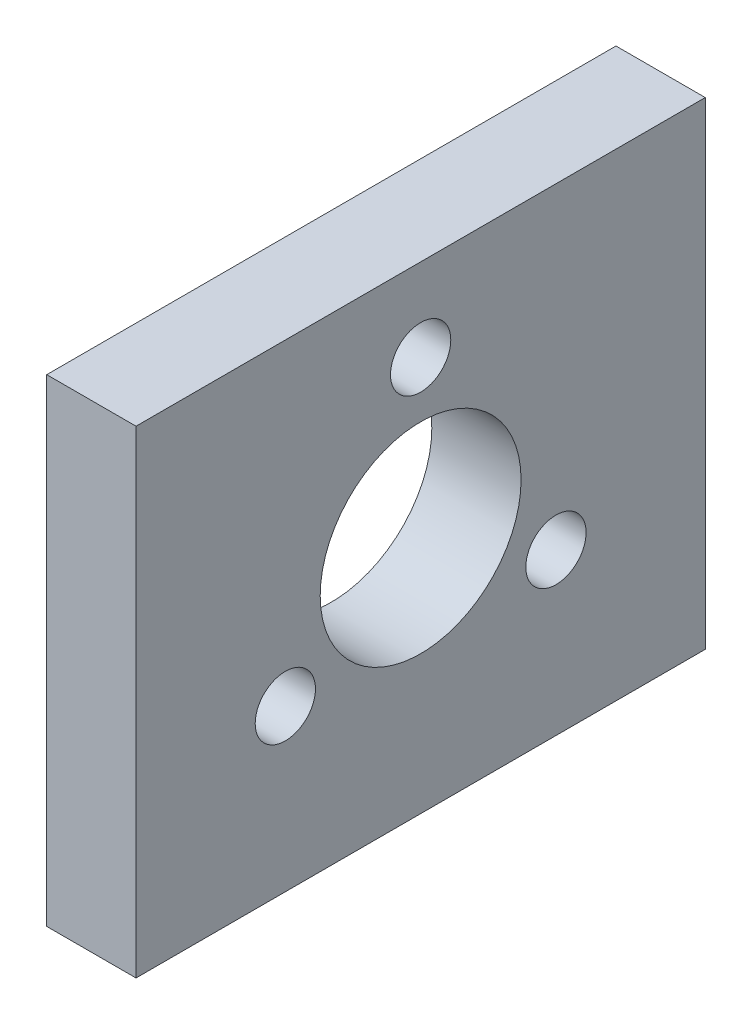
ISO-10303-21;
HEADER;
FILE_DESCRIPTION(('STEP AP214'),'2;1');
FILE_NAME('part.step','',(''),(''),'','','');
FILE_SCHEMA(('AUTOMOTIVE_DESIGN { 1 0 10303 214 1 1 1 1 }'));
ENDSEC;
DATA;
#1=APPLICATION_CONTEXT('core data for automotive mechanical design processes');
#2=APPLICATION_PROTOCOL_DEFINITION('international standard','automotive_design',2000,#1);
#3=PRODUCT_CONTEXT('',#1,'mechanical');
#4=PRODUCT('Part','Part','',(#3));
#5=PRODUCT_RELATED_PRODUCT_CATEGORY('part','',(#4));
#6=PRODUCT_DEFINITION_FORMATION('','',#4);
#7=PRODUCT_DEFINITION_CONTEXT('part definition',#1,'design');
#8=PRODUCT_DEFINITION('design','',#6,#7);
#9=PRODUCT_DEFINITION_SHAPE('','',#8);
#10=(LENGTH_UNIT() NAMED_UNIT(*) SI_UNIT(.MILLI.,.METRE.));
#11=(NAMED_UNIT(*) PLANE_ANGLE_UNIT() SI_UNIT($,.RADIAN.));
#12=(NAMED_UNIT(*) SI_UNIT($,.STERADIAN.) SOLID_ANGLE_UNIT());
#13=UNCERTAINTY_MEASURE_WITH_UNIT(LENGTH_MEASURE(1.E-05),#10,'distance_accuracy_value','');
#14=(GEOMETRIC_REPRESENTATION_CONTEXT(3) GLOBAL_UNCERTAINTY_ASSIGNED_CONTEXT((#13)) GLOBAL_UNIT_ASSIGNED_CONTEXT((#10,
#11,#12)) REPRESENTATION_CONTEXT('',''));
#15=CARTESIAN_POINT('',(0.,0.,0.));
#16=DIRECTION('',(0.,0.,1.));
#17=DIRECTION('',(1.,0.,0.));
#18=AXIS2_PLACEMENT_3D('',#15,#16,#17);
#19=CARTESIAN_POINT('',(4.,-10.7047730103985,12.7512407953853));
#20=DIRECTION('',(0.,0.,-1.));
#21=DIRECTION('',(-1.,0.,0.));
#22=AXIS2_PLACEMENT_3D('',#19,#20,#21);
#23=PLANE('',#22);
#24=DIRECTION('',(0.,-1.,0.));
#25=VECTOR('',#24,1.);
#26=CARTESIAN_POINT('',(0.,-10.7047730103985,12.7512407953853));
#27=LINE('',#26,#25);
#28=CARTESIAN_POINT('',(0.,10.7047730103985,12.7512407953853));
#29=VERTEX_POINT('',#28);
#30=CARTESIAN_POINT('',(0.,-10.7047730103985,12.7512407953853));
#31=VERTEX_POINT('',#30);
#32=EDGE_CURVE('E96',#29,#31,#27,.T.);
#33=ORIENTED_EDGE('',*,*,#32,.T.);
#34=DIRECTION('',(-1.,0.,0.));
#35=VECTOR('',#34,1.);
#36=CARTESIAN_POINT('',(4.,-10.7047730103985,12.7512407953853));
#37=LINE('',#36,#35);
#38=CARTESIAN_POINT('',(4.,-10.7047730103985,12.7512407953853));
#39=VERTEX_POINT('',#38);
#40=EDGE_CURVE('E11',#39,#31,#37,.T.);
#41=ORIENTED_EDGE('',*,*,#40,.F.);
#42=DIRECTION('',(0.,-1.,0.));
#43=VECTOR('',#42,1.);
#44=CARTESIAN_POINT('',(4.,-10.7047730103985,12.7512407953853));
#45=LINE('',#44,#43);
#46=CARTESIAN_POINT('',(4.,10.7047730103985,12.7512407953853));
#47=VERTEX_POINT('',#46);
#48=EDGE_CURVE('E84',#47,#39,#45,.T.);
#49=ORIENTED_EDGE('',*,*,#48,.F.);
#50=DIRECTION('',(-1.,0.,0.));
#51=VECTOR('',#50,1.);
#52=CARTESIAN_POINT('',(4.,10.7047730103985,12.7512407953853));
#53=LINE('',#52,#51);
#54=EDGE_CURVE('E92',#47,#29,#53,.T.);
#55=ORIENTED_EDGE('',*,*,#54,.T.);
#56=EDGE_LOOP('',(#33,#41,#49,#55));
#57=FACE_BOUND('',#56,.T.);
#58=ADVANCED_FACE('F33',(#57),#23,.F.);
#59=CARTESIAN_POINT('',(4.,-10.7047730103985,-12.7512407953853));
#60=DIRECTION('',(0.,1.,0.));
#61=DIRECTION('',(0.,0.,1.));
#62=AXIS2_PLACEMENT_3D('',#59,#60,#61);
#63=PLANE('',#62);
#64=DIRECTION('',(0.,0.,-1.));
#65=VECTOR('',#64,1.);
#66=CARTESIAN_POINT('',(0.,-10.7047730103985,-12.7512407953853));
#67=LINE('',#66,#65);
#68=CARTESIAN_POINT('',(0.,-10.7047730103985,-12.7512407953853));
#69=VERTEX_POINT('',#68);
#70=EDGE_CURVE('E88',#31,#69,#67,.T.);
#71=ORIENTED_EDGE('',*,*,#70,.T.);
#72=DIRECTION('',(-1.,0.,0.));
#73=VECTOR('',#72,1.);
#74=CARTESIAN_POINT('',(4.,-10.7047730103985,-12.7512407953853));
#75=LINE('',#74,#73);
#76=CARTESIAN_POINT('',(4.,-10.7047730103985,-12.7512407953853));
#77=VERTEX_POINT('',#76);
#78=EDGE_CURVE('E41',#77,#69,#75,.T.);
#79=ORIENTED_EDGE('',*,*,#78,.F.);
#80=DIRECTION('',(0.,0.,-1.));
#81=VECTOR('',#80,1.);
#82=CARTESIAN_POINT('',(4.,-10.7047730103985,-12.7512407953853));
#83=LINE('',#82,#81);
#84=EDGE_CURVE('E79',#39,#77,#83,.T.);
#85=ORIENTED_EDGE('',*,*,#84,.F.);
#86=ORIENTED_EDGE('',*,*,#40,.T.);
#87=EDGE_LOOP('',(#71,#79,#85,#86));
#88=FACE_BOUND('',#87,.T.);
#89=ADVANCED_FACE('F87',(#88),#63,.F.);
#90=CARTESIAN_POINT('',(4.,-10.7047730103985,-12.7512407953853));
#91=DIRECTION('',(0.,0.,1.));
#92=DIRECTION('',(1.,0.,0.));
#93=AXIS2_PLACEMENT_3D('',#90,#91,#92);
#94=PLANE('',#93);
#95=DIRECTION('',(0.,1.,0.));
#96=VECTOR('',#95,1.);
#97=CARTESIAN_POINT('',(0.,-10.7047730103985,-12.7512407953853));
#98=LINE('',#97,#96);
#99=CARTESIAN_POINT('',(0.,10.7047730103985,-12.7512407953853));
#100=VERTEX_POINT('',#99);
#101=EDGE_CURVE('E66',#69,#100,#98,.T.);
#102=ORIENTED_EDGE('',*,*,#101,.T.);
#103=DIRECTION('',(-1.,0.,0.));
#104=VECTOR('',#103,1.);
#105=CARTESIAN_POINT('',(4.,10.7047730103985,-12.7512407953853));
#106=LINE('',#105,#104);
#107=CARTESIAN_POINT('',(4.,10.7047730103985,-12.7512407953853));
#108=VERTEX_POINT('',#107);
#109=EDGE_CURVE('E89',#108,#100,#106,.T.);
#110=ORIENTED_EDGE('',*,*,#109,.F.);
#111=DIRECTION('',(0.,1.,0.));
#112=VECTOR('',#111,1.);
#113=CARTESIAN_POINT('',(4.,-10.7047730103985,-12.7512407953853));
#114=LINE('',#113,#112);
#115=EDGE_CURVE('E82',#77,#108,#114,.T.);
#116=ORIENTED_EDGE('',*,*,#115,.F.);
#117=ORIENTED_EDGE('',*,*,#78,.T.);
#118=EDGE_LOOP('',(#102,#110,#116,#117));
#119=FACE_BOUND('',#118,.T.);
#120=ADVANCED_FACE('F90',(#119),#94,.F.);
#121=CARTESIAN_POINT('',(4.,10.7047730103985,-12.7512407953853));
#122=DIRECTION('',(0.,-1.,0.));
#123=DIRECTION('',(0.,0.,-1.));
#124=AXIS2_PLACEMENT_3D('',#121,#122,#123);
#125=PLANE('',#124);
#126=DIRECTION('',(0.,0.,1.));
#127=VECTOR('',#126,1.);
#128=CARTESIAN_POINT('',(0.,10.7047730103985,-12.7512407953853));
#129=LINE('',#128,#127);
#130=EDGE_CURVE('E72',#100,#29,#129,.T.);
#131=ORIENTED_EDGE('',*,*,#130,.T.);
#132=ORIENTED_EDGE('',*,*,#54,.F.);
#133=DIRECTION('',(0.,0.,1.));
#134=VECTOR('',#133,1.);
#135=CARTESIAN_POINT('',(4.,10.7047730103985,-12.7512407953853));
#136=LINE('',#135,#134);
#137=EDGE_CURVE('E49',#108,#47,#136,.T.);
#138=ORIENTED_EDGE('',*,*,#137,.F.);
#139=ORIENTED_EDGE('',*,*,#109,.T.);
#140=EDGE_LOOP('',(#131,#132,#138,#139));
#141=FACE_BOUND('',#140,.T.);
#142=ADVANCED_FACE('F104',(#141),#125,.F.);
#143=CARTESIAN_POINT('',(4.,0.,0.));
#144=DIRECTION('',(1.,0.,0.));
#145=DIRECTION('',(0.,0.,-1.));
#146=AXIS2_PLACEMENT_3D('',#143,#144,#145);
#147=PLANE('',#146);
#148=CARTESIAN_POINT('',(4.,0.,0.));
#149=DIRECTION('',(-1.,0.,0.));
#150=DIRECTION('',(0.,0.,1.));
#151=AXIS2_PLACEMENT_3D('',#148,#149,#150);
#152=CIRCLE('',#151,4.5);
#153=CARTESIAN_POINT('',(4.,0.,4.5));
#154=VERTEX_POINT('',#153);
#155=EDGE_CURVE('E127',#154,#154,#152,.T.);
#156=ORIENTED_EDGE('',*,*,#155,.T.);
#157=EDGE_LOOP('',(#156));
#158=FACE_BOUND('',#157,.T.);
#159=CARTESIAN_POINT('',(4.,7.,0.));
#160=DIRECTION('',(1.,0.,0.));
#161=DIRECTION('',(0.,0.,-1.));
#162=AXIS2_PLACEMENT_3D('',#159,#160,#161);
#163=CIRCLE('',#162,1.34999999999999);
#164=CARTESIAN_POINT('',(4.,7.,-1.34999999999999));
#165=VERTEX_POINT('',#164);
#166=EDGE_CURVE('E121',#165,#165,#163,.T.);
#167=ORIENTED_EDGE('',*,*,#166,.F.);
#168=EDGE_LOOP('',(#167));
#169=FACE_BOUND('',#168,.T.);
#170=CARTESIAN_POINT('',(4.,-3.50000000000026,-6.06217782649063));
#171=DIRECTION('',(1.,0.,0.));
#172=DIRECTION('',(0.,0.,-1.));
#173=AXIS2_PLACEMENT_3D('',#170,#171,#172);
#174=CIRCLE('',#173,1.34999999999999);
#175=CARTESIAN_POINT('',(4.,-3.50000000000026,-7.41217782649061));
#176=VERTEX_POINT('',#175);
#177=EDGE_CURVE('E115',#176,#176,#174,.T.);
#178=ORIENTED_EDGE('',*,*,#177,.F.);
#179=EDGE_LOOP('',(#178));
#180=FACE_BOUND('',#179,.T.);
#181=CARTESIAN_POINT('',(4.,-3.49999999999974,6.06217782649152));
#182=DIRECTION('',(1.,0.,0.));
#183=DIRECTION('',(0.,0.,-1.));
#184=AXIS2_PLACEMENT_3D('',#181,#182,#183);
#185=CIRCLE('',#184,1.34999999999999);
#186=CARTESIAN_POINT('',(4.,-3.49999999999974,4.71217782649153));
#187=VERTEX_POINT('',#186);
#188=EDGE_CURVE('E99',#187,#187,#185,.T.);
#189=ORIENTED_EDGE('',*,*,#188,.F.);
#190=EDGE_LOOP('',(#189));
#191=FACE_BOUND('',#190,.T.);
#192=ORIENTED_EDGE('',*,*,#48,.T.);
#193=ORIENTED_EDGE('',*,*,#84,.T.);
#194=ORIENTED_EDGE('',*,*,#115,.T.);
#195=ORIENTED_EDGE('',*,*,#137,.T.);
#196=EDGE_LOOP('',(#192,#193,#194,#195));
#197=FACE_BOUND('',#196,.T.);
#198=ADVANCED_FACE('F80',(#158,#169,#180,#191,#197),#147,.T.);
#199=CARTESIAN_POINT('',(0.,0.,0.));
#200=DIRECTION('',(1.,0.,0.));
#201=DIRECTION('',(0.,0.,-1.));
#202=AXIS2_PLACEMENT_3D('',#199,#200,#201);
#203=PLANE('',#202);
#204=CARTESIAN_POINT('',(0.,0.,0.));
#205=DIRECTION('',(-1.,0.,0.));
#206=DIRECTION('',(0.,0.,1.));
#207=AXIS2_PLACEMENT_3D('',#204,#205,#206);
#208=CIRCLE('',#207,4.5);
#209=CARTESIAN_POINT('',(0.,0.,4.5));
#210=VERTEX_POINT('',#209);
#211=EDGE_CURVE('E128',#210,#210,#208,.T.);
#212=ORIENTED_EDGE('',*,*,#211,.F.);
#213=EDGE_LOOP('',(#212));
#214=FACE_BOUND('',#213,.T.);
#215=CARTESIAN_POINT('',(0.,7.,0.));
#216=DIRECTION('',(-1.,0.,0.));
#217=DIRECTION('',(0.,0.,1.));
#218=AXIS2_PLACEMENT_3D('',#215,#216,#217);
#219=CIRCLE('',#218,1.34999999999999);
#220=CARTESIAN_POINT('',(0.,7.,1.34999999999999));
#221=VERTEX_POINT('',#220);
#222=EDGE_CURVE('E124',#221,#221,#219,.T.);
#223=ORIENTED_EDGE('',*,*,#222,.F.);
#224=EDGE_LOOP('',(#223));
#225=FACE_BOUND('',#224,.T.);
#226=CARTESIAN_POINT('',(0.,-3.50000000000026,-6.06217782649063));
#227=DIRECTION('',(-1.,0.,0.));
#228=DIRECTION('',(0.,0.,1.));
#229=AXIS2_PLACEMENT_3D('',#226,#227,#228);
#230=CIRCLE('',#229,1.34999999999999);
#231=CARTESIAN_POINT('',(0.,-3.50000000000026,-4.71217782649064));
#232=VERTEX_POINT('',#231);
#233=EDGE_CURVE('E118',#232,#232,#230,.T.);
#234=ORIENTED_EDGE('',*,*,#233,.F.);
#235=EDGE_LOOP('',(#234));
#236=FACE_BOUND('',#235,.T.);
#237=CARTESIAN_POINT('',(0.,-3.49999999999974,6.06217782649152));
#238=DIRECTION('',(-1.,0.,0.));
#239=DIRECTION('',(0.,0.,1.));
#240=AXIS2_PLACEMENT_3D('',#237,#238,#239);
#241=CIRCLE('',#240,1.34999999999999);
#242=CARTESIAN_POINT('',(0.,-3.49999999999974,7.41217782649151));
#243=VERTEX_POINT('',#242);
#244=EDGE_CURVE('E112',#243,#243,#241,.T.);
#245=ORIENTED_EDGE('',*,*,#244,.F.);
#246=EDGE_LOOP('',(#245));
#247=FACE_BOUND('',#246,.T.);
#248=ORIENTED_EDGE('',*,*,#32,.F.);
#249=ORIENTED_EDGE('',*,*,#130,.F.);
#250=ORIENTED_EDGE('',*,*,#101,.F.);
#251=ORIENTED_EDGE('',*,*,#70,.F.);
#252=EDGE_LOOP('',(#248,#249,#250,#251));
#253=FACE_BOUND('',#252,.T.);
#254=ADVANCED_FACE('F107',(#214,#225,#236,#247,#253),#203,.F.);
#255=CARTESIAN_POINT('',(0.,-3.49999999999974,6.06217782649152));
#256=DIRECTION('',(-1.,0.,0.));
#257=DIRECTION('',(0.,0.,1.));
#258=AXIS2_PLACEMENT_3D('',#255,#256,#257);
#259=CYLINDRICAL_SURFACE('',#258,1.34999999999999);
#260=ORIENTED_EDGE('',*,*,#188,.T.);
#261=EDGE_LOOP('',(#260));
#262=FACE_BOUND('',#261,.T.);
#263=ORIENTED_EDGE('',*,*,#244,.T.);
#264=EDGE_LOOP('',(#263));
#265=FACE_BOUND('',#264,.T.);
#266=ADVANCED_FACE('F145',(#262,#265),#259,.F.);
#267=CARTESIAN_POINT('',(0.,-3.50000000000026,-6.06217782649063));
#268=DIRECTION('',(-1.,0.,0.));
#269=DIRECTION('',(0.,0.,1.));
#270=AXIS2_PLACEMENT_3D('',#267,#268,#269);
#271=CYLINDRICAL_SURFACE('',#270,1.34999999999999);
#272=ORIENTED_EDGE('',*,*,#177,.T.);
#273=EDGE_LOOP('',(#272));
#274=FACE_BOUND('',#273,.T.);
#275=ORIENTED_EDGE('',*,*,#233,.T.);
#276=EDGE_LOOP('',(#275));
#277=FACE_BOUND('',#276,.T.);
#278=ADVANCED_FACE('F154',(#274,#277),#271,.F.);
#279=CARTESIAN_POINT('',(0.,7.,0.));
#280=DIRECTION('',(-1.,0.,0.));
#281=DIRECTION('',(0.,0.,1.));
#282=AXIS2_PLACEMENT_3D('',#279,#280,#281);
#283=CYLINDRICAL_SURFACE('',#282,1.34999999999999);
#284=ORIENTED_EDGE('',*,*,#166,.T.);
#285=EDGE_LOOP('',(#284));
#286=FACE_BOUND('',#285,.T.);
#287=ORIENTED_EDGE('',*,*,#222,.T.);
#288=EDGE_LOOP('',(#287));
#289=FACE_BOUND('',#288,.T.);
#290=ADVANCED_FACE('F139',(#286,#289),#283,.F.);
#291=CARTESIAN_POINT('',(4.,0.,0.));
#292=DIRECTION('',(-1.,0.,0.));
#293=DIRECTION('',(0.,0.,1.));
#294=AXIS2_PLACEMENT_3D('',#291,#292,#293);
#295=CYLINDRICAL_SURFACE('',#294,4.5);
#296=ORIENTED_EDGE('',*,*,#155,.F.);
#297=EDGE_LOOP('',(#296));
#298=FACE_BOUND('',#297,.T.);
#299=ORIENTED_EDGE('',*,*,#211,.T.);
#300=EDGE_LOOP('',(#299));
#301=FACE_BOUND('',#300,.T.);
#302=ADVANCED_FACE('F136',(#298,#301),#295,.F.);
#303=CLOSED_SHELL('',(#58,#89,#120,#142,#198,#254,#266,#278,#290,#302));
#304=MANIFOLD_SOLID_BREP('B2',#303);
#305=ADVANCED_BREP_SHAPE_REPRESENTATION('',(#18,#304),#14);
#306=SHAPE_DEFINITION_REPRESENTATION(#9,#305);
ENDSEC;
END-ISO-10303-21;
